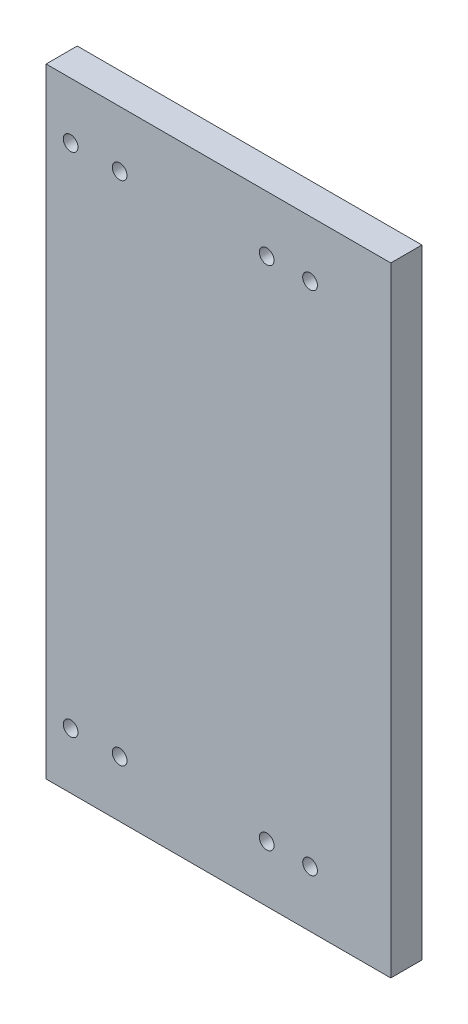
ISO-10303-21;
HEADER;
FILE_DESCRIPTION(('STEP AP214'),'2;1');
FILE_NAME('part.step','',(''),(''),'','','');
FILE_SCHEMA(('AUTOMOTIVE_DESIGN { 1 0 10303 214 1 1 1 1 }'));
ENDSEC;
DATA;
#1=APPLICATION_CONTEXT('core data for automotive mechanical design processes');
#2=APPLICATION_PROTOCOL_DEFINITION('international standard','automotive_design',2000,#1);
#3=PRODUCT_CONTEXT('',#1,'mechanical');
#4=PRODUCT('Part','Part','',(#3));
#5=PRODUCT_RELATED_PRODUCT_CATEGORY('part','',(#4));
#6=PRODUCT_DEFINITION_FORMATION('','',#4);
#7=PRODUCT_DEFINITION_CONTEXT('part definition',#1,'design');
#8=PRODUCT_DEFINITION('design','',#6,#7);
#9=PRODUCT_DEFINITION_SHAPE('','',#8);
#10=(LENGTH_UNIT() NAMED_UNIT(*) SI_UNIT(.MILLI.,.METRE.));
#11=(NAMED_UNIT(*) PLANE_ANGLE_UNIT() SI_UNIT($,.RADIAN.));
#12=(NAMED_UNIT(*) SI_UNIT($,.STERADIAN.) SOLID_ANGLE_UNIT());
#13=UNCERTAINTY_MEASURE_WITH_UNIT(LENGTH_MEASURE(1.E-05),#10,'distance_accuracy_value','');
#14=(GEOMETRIC_REPRESENTATION_CONTEXT(3) GLOBAL_UNCERTAINTY_ASSIGNED_CONTEXT((#13)) GLOBAL_UNIT_ASSIGNED_CONTEXT((#10,
#11,#12)) REPRESENTATION_CONTEXT('',''));
#15=CARTESIAN_POINT('',(0.,0.,0.));
#16=DIRECTION('',(0.,0.,1.));
#17=DIRECTION('',(1.,0.,0.));
#18=AXIS2_PLACEMENT_3D('',#15,#16,#17);
#19=CARTESIAN_POINT('',(0.,0.,6.35));
#20=DIRECTION('',(0.,0.,-1.));
#21=DIRECTION('',(-1.,0.,0.));
#22=AXIS2_PLACEMENT_3D('',#19,#20,#21);
#23=PLANE('',#22);
#24=DIRECTION('',(1.,0.,0.));
#25=VECTOR('',#24,1.);
#26=CARTESIAN_POINT('',(65.1371709194343,27.0166737048767,6.35));
#27=LINE('',#26,#25);
#28=CARTESIAN_POINT('',(-5.17846307717951,27.0166737048767,6.35));
#29=VERTEX_POINT('',#28);
#30=CARTESIAN_POINT('',(65.1371709194343,27.0166737048767,6.35));
#31=VERTEX_POINT('',#30);
#32=EDGE_CURVE('E95',#29,#31,#27,.T.);
#33=ORIENTED_EDGE('',*,*,#32,.T.);
#34=DIRECTION('',(0.,1.,0.));
#35=VECTOR('',#34,1.);
#36=CARTESIAN_POINT('',(65.1371709194343,153.356673704877,6.35));
#37=LINE('',#36,#35);
#38=CARTESIAN_POINT('',(65.1371709194343,153.356673704877,6.35));
#39=VERTEX_POINT('',#38);
#40=EDGE_CURVE('E89',#31,#39,#37,.T.);
#41=ORIENTED_EDGE('',*,*,#40,.T.);
#42=DIRECTION('',(-1.,0.,0.));
#43=VECTOR('',#42,1.);
#44=CARTESIAN_POINT('',(65.1371709194343,153.356673704877,6.35));
#45=LINE('',#44,#43);
#46=CARTESIAN_POINT('',(-5.17846307717951,153.356673704877,6.35));
#47=VERTEX_POINT('',#46);
#48=EDGE_CURVE('E92',#39,#47,#45,.T.);
#49=ORIENTED_EDGE('',*,*,#48,.T.);
#50=DIRECTION('',(0.,-1.,0.));
#51=VECTOR('',#50,1.);
#52=CARTESIAN_POINT('',(-5.17846307717951,153.356673704877,6.35));
#53=LINE('',#52,#51);
#54=EDGE_CURVE('E61',#47,#29,#53,.T.);
#55=ORIENTED_EDGE('',*,*,#54,.T.);
#56=EDGE_LOOP('',(#33,#41,#49,#55));
#57=FACE_BOUND('',#56,.T.);
#58=CARTESIAN_POINT('',(39.8215369228205,38.4866737048767,6.35));
#59=DIRECTION('',(0.,0.,1.));
#60=DIRECTION('',(1.,0.,0.));
#61=AXIS2_PLACEMENT_3D('',#58,#59,#60);
#62=CIRCLE('',#61,1.5);
#63=CARTESIAN_POINT('',(41.3215369228205,38.4866737048767,6.35));
#64=VERTEX_POINT('',#63);
#65=EDGE_CURVE('E117',#64,#64,#62,.T.);
#66=ORIENTED_EDGE('',*,*,#65,.F.);
#67=EDGE_LOOP('',(#66));
#68=FACE_BOUND('',#67,.T.);
#69=CARTESIAN_POINT('',(9.82153692282049,38.4866737048767,6.35));
#70=DIRECTION('',(0.,0.,1.));
#71=DIRECTION('',(1.,0.,0.));
#72=AXIS2_PLACEMENT_3D('',#69,#70,#71);
#73=CIRCLE('',#72,1.5);
#74=CARTESIAN_POINT('',(11.3215369228205,38.4866737048767,6.35));
#75=VERTEX_POINT('',#74);
#76=EDGE_CURVE('E136',#75,#75,#73,.T.);
#77=ORIENTED_EDGE('',*,*,#76,.F.);
#78=EDGE_LOOP('',(#77));
#79=FACE_BOUND('',#78,.T.);
#80=CARTESIAN_POINT('',(-0.178463077179506,38.4866737048767,6.35));
#81=DIRECTION('',(0.,0.,1.));
#82=DIRECTION('',(1.,0.,0.));
#83=AXIS2_PLACEMENT_3D('',#80,#81,#82);
#84=CIRCLE('',#83,1.5);
#85=CARTESIAN_POINT('',(1.3215369228205,38.4866737048767,6.35));
#86=VERTEX_POINT('',#85);
#87=EDGE_CURVE('E144',#86,#86,#84,.T.);
#88=ORIENTED_EDGE('',*,*,#87,.F.);
#89=EDGE_LOOP('',(#88));
#90=FACE_BOUND('',#89,.T.);
#91=CARTESIAN_POINT('',(48.6715369228205,38.4866737048767,6.35));
#92=DIRECTION('',(0.,0.,1.));
#93=DIRECTION('',(1.,0.,0.));
#94=AXIS2_PLACEMENT_3D('',#91,#92,#93);
#95=CIRCLE('',#94,1.5);
#96=CARTESIAN_POINT('',(50.1715369228205,38.4866737048767,6.35));
#97=VERTEX_POINT('',#96);
#98=EDGE_CURVE('E152',#97,#97,#95,.T.);
#99=ORIENTED_EDGE('',*,*,#98,.F.);
#100=EDGE_LOOP('',(#99));
#101=FACE_BOUND('',#100,.T.);
#102=CARTESIAN_POINT('',(48.6715369228205,141.886673704877,6.35));
#103=DIRECTION('',(0.,0.,1.));
#104=DIRECTION('',(-1.,0.,0.));
#105=AXIS2_PLACEMENT_3D('',#102,#103,#104);
#106=CIRCLE('',#105,1.5);
#107=CARTESIAN_POINT('',(47.1715369228205,141.886673704877,6.35));
#108=VERTEX_POINT('',#107);
#109=EDGE_CURVE('E160',#108,#108,#106,.T.);
#110=ORIENTED_EDGE('',*,*,#109,.F.);
#111=EDGE_LOOP('',(#110));
#112=FACE_BOUND('',#111,.T.);
#113=CARTESIAN_POINT('',(-0.178463077179506,141.886673704877,6.35));
#114=DIRECTION('',(0.,0.,1.));
#115=DIRECTION('',(-1.,0.,0.));
#116=AXIS2_PLACEMENT_3D('',#113,#114,#115);
#117=CIRCLE('',#116,1.5);
#118=CARTESIAN_POINT('',(-1.67846307717951,141.886673704877,6.35));
#119=VERTEX_POINT('',#118);
#120=EDGE_CURVE('E168',#119,#119,#117,.T.);
#121=ORIENTED_EDGE('',*,*,#120,.F.);
#122=EDGE_LOOP('',(#121));
#123=FACE_BOUND('',#122,.T.);
#124=CARTESIAN_POINT('',(9.82153692282049,141.886673704877,6.35));
#125=DIRECTION('',(0.,0.,1.));
#126=DIRECTION('',(-1.,0.,0.));
#127=AXIS2_PLACEMENT_3D('',#124,#125,#126);
#128=CIRCLE('',#127,1.5);
#129=CARTESIAN_POINT('',(8.32153692282049,141.886673704877,6.35));
#130=VERTEX_POINT('',#129);
#131=EDGE_CURVE('E176',#130,#130,#128,.T.);
#132=ORIENTED_EDGE('',*,*,#131,.F.);
#133=EDGE_LOOP('',(#132));
#134=FACE_BOUND('',#133,.T.);
#135=CARTESIAN_POINT('',(39.8215369228205,141.886673704877,6.35));
#136=DIRECTION('',(0.,0.,1.));
#137=DIRECTION('',(-1.,0.,0.));
#138=AXIS2_PLACEMENT_3D('',#135,#136,#137);
#139=CIRCLE('',#138,1.5);
#140=CARTESIAN_POINT('',(38.3215369228205,141.886673704877,6.35));
#141=VERTEX_POINT('',#140);
#142=EDGE_CURVE('E184',#141,#141,#139,.T.);
#143=ORIENTED_EDGE('',*,*,#142,.F.);
#144=EDGE_LOOP('',(#143));
#145=FACE_BOUND('',#144,.T.);
#146=ADVANCED_FACE('F43',(#57,#68,#79,#90,#101,#112,#123,#134,#145),#23,.F.);
#147=CARTESIAN_POINT('',(0.,0.,0.));
#148=DIRECTION('',(0.,0.,-1.));
#149=DIRECTION('',(-1.,0.,0.));
#150=AXIS2_PLACEMENT_3D('',#147,#148,#149);
#151=PLANE('',#150);
#152=CARTESIAN_POINT('',(9.82153692282049,141.886673704877,0.));
#153=DIRECTION('',(0.,0.,1.));
#154=DIRECTION('',(-1.,0.,0.));
#155=AXIS2_PLACEMENT_3D('',#152,#153,#154);
#156=CIRCLE('',#155,1.5);
#157=CARTESIAN_POINT('',(8.32153692282049,141.886673704877,0.));
#158=VERTEX_POINT('',#157);
#159=EDGE_CURVE('E180',#158,#158,#156,.T.);
#160=ORIENTED_EDGE('',*,*,#159,.T.);
#161=EDGE_LOOP('',(#160));
#162=FACE_BOUND('',#161,.T.);
#163=CARTESIAN_POINT('',(48.6715369228205,141.886673704877,0.));
#164=DIRECTION('',(0.,0.,1.));
#165=DIRECTION('',(-1.,0.,0.));
#166=AXIS2_PLACEMENT_3D('',#163,#164,#165);
#167=CIRCLE('',#166,1.5);
#168=CARTESIAN_POINT('',(47.1715369228205,141.886673704877,0.));
#169=VERTEX_POINT('',#168);
#170=EDGE_CURVE('E164',#169,#169,#167,.T.);
#171=ORIENTED_EDGE('',*,*,#170,.T.);
#172=EDGE_LOOP('',(#171));
#173=FACE_BOUND('',#172,.T.);
#174=CARTESIAN_POINT('',(-0.178463077179506,38.4866737048767,0.));
#175=DIRECTION('',(0.,0.,1.));
#176=DIRECTION('',(1.,0.,0.));
#177=AXIS2_PLACEMENT_3D('',#174,#175,#176);
#178=CIRCLE('',#177,1.5);
#179=CARTESIAN_POINT('',(1.3215369228205,38.4866737048767,0.));
#180=VERTEX_POINT('',#179);
#181=EDGE_CURVE('E148',#180,#180,#178,.T.);
#182=ORIENTED_EDGE('',*,*,#181,.T.);
#183=EDGE_LOOP('',(#182));
#184=FACE_BOUND('',#183,.T.);
#185=CARTESIAN_POINT('',(39.8215369228205,38.4866737048767,0.));
#186=DIRECTION('',(0.,0.,1.));
#187=DIRECTION('',(1.,0.,0.));
#188=AXIS2_PLACEMENT_3D('',#185,#186,#187);
#189=CIRCLE('',#188,1.5);
#190=CARTESIAN_POINT('',(41.3215369228205,38.4866737048767,0.));
#191=VERTEX_POINT('',#190);
#192=EDGE_CURVE('E132',#191,#191,#189,.T.);
#193=ORIENTED_EDGE('',*,*,#192,.T.);
#194=EDGE_LOOP('',(#193));
#195=FACE_BOUND('',#194,.T.);
#196=DIRECTION('',(1.,0.,0.));
#197=VECTOR('',#196,1.);
#198=CARTESIAN_POINT('',(65.1371709194343,27.0166737048767,0.));
#199=LINE('',#198,#197);
#200=CARTESIAN_POINT('',(-5.17846307717951,27.0166737048767,0.));
#201=VERTEX_POINT('',#200);
#202=CARTESIAN_POINT('',(65.1371709194343,27.0166737048767,0.));
#203=VERTEX_POINT('',#202);
#204=EDGE_CURVE('E113',#201,#203,#199,.T.);
#205=ORIENTED_EDGE('',*,*,#204,.F.);
#206=DIRECTION('',(0.,-1.,0.));
#207=VECTOR('',#206,1.);
#208=CARTESIAN_POINT('',(-5.17846307717951,27.0166737048767,0.));
#209=LINE('',#208,#207);
#210=CARTESIAN_POINT('',(-5.17846307717951,153.356673704877,0.));
#211=VERTEX_POINT('',#210);
#212=EDGE_CURVE('E78',#211,#201,#209,.T.);
#213=ORIENTED_EDGE('',*,*,#212,.F.);
#214=DIRECTION('',(-1.,0.,0.));
#215=VECTOR('',#214,1.);
#216=CARTESIAN_POINT('',(65.1371709194343,153.356673704877,0.));
#217=LINE('',#216,#215);
#218=CARTESIAN_POINT('',(65.1371709194343,153.356673704877,0.));
#219=VERTEX_POINT('',#218);
#220=EDGE_CURVE('E120',#219,#211,#217,.T.);
#221=ORIENTED_EDGE('',*,*,#220,.F.);
#222=DIRECTION('',(0.,1.,0.));
#223=VECTOR('',#222,1.);
#224=CARTESIAN_POINT('',(65.1371709194343,153.356673704877,0.));
#225=LINE('',#224,#223);
#226=EDGE_CURVE('E101',#203,#219,#225,.T.);
#227=ORIENTED_EDGE('',*,*,#226,.F.);
#228=EDGE_LOOP('',(#205,#213,#221,#227));
#229=FACE_BOUND('',#228,.T.);
#230=CARTESIAN_POINT('',(9.82153692282049,38.4866737048767,0.));
#231=DIRECTION('',(0.,0.,1.));
#232=DIRECTION('',(1.,0.,0.));
#233=AXIS2_PLACEMENT_3D('',#230,#231,#232);
#234=CIRCLE('',#233,1.5);
#235=CARTESIAN_POINT('',(11.3215369228205,38.4866737048767,0.));
#236=VERTEX_POINT('',#235);
#237=EDGE_CURVE('E140',#236,#236,#234,.T.);
#238=ORIENTED_EDGE('',*,*,#237,.T.);
#239=EDGE_LOOP('',(#238));
#240=FACE_BOUND('',#239,.T.);
#241=CARTESIAN_POINT('',(48.6715369228205,38.4866737048767,0.));
#242=DIRECTION('',(0.,0.,1.));
#243=DIRECTION('',(1.,0.,0.));
#244=AXIS2_PLACEMENT_3D('',#241,#242,#243);
#245=CIRCLE('',#244,1.5);
#246=CARTESIAN_POINT('',(50.1715369228205,38.4866737048767,0.));
#247=VERTEX_POINT('',#246);
#248=EDGE_CURVE('E156',#247,#247,#245,.T.);
#249=ORIENTED_EDGE('',*,*,#248,.T.);
#250=EDGE_LOOP('',(#249));
#251=FACE_BOUND('',#250,.T.);
#252=CARTESIAN_POINT('',(-0.178463077179506,141.886673704877,0.));
#253=DIRECTION('',(0.,0.,1.));
#254=DIRECTION('',(-1.,0.,0.));
#255=AXIS2_PLACEMENT_3D('',#252,#253,#254);
#256=CIRCLE('',#255,1.5);
#257=CARTESIAN_POINT('',(-1.67846307717951,141.886673704877,0.));
#258=VERTEX_POINT('',#257);
#259=EDGE_CURVE('E172',#258,#258,#256,.T.);
#260=ORIENTED_EDGE('',*,*,#259,.T.);
#261=EDGE_LOOP('',(#260));
#262=FACE_BOUND('',#261,.T.);
#263=CARTESIAN_POINT('',(39.8215369228205,141.886673704877,0.));
#264=DIRECTION('',(0.,0.,1.));
#265=DIRECTION('',(-1.,0.,0.));
#266=AXIS2_PLACEMENT_3D('',#263,#264,#265);
#267=CIRCLE('',#266,1.5);
#268=CARTESIAN_POINT('',(38.3215369228205,141.886673704877,0.));
#269=VERTEX_POINT('',#268);
#270=EDGE_CURVE('E188',#269,#269,#267,.T.);
#271=ORIENTED_EDGE('',*,*,#270,.T.);
#272=EDGE_LOOP('',(#271));
#273=FACE_BOUND('',#272,.T.);
#274=ADVANCED_FACE('F200',(#162,#173,#184,#195,#229,#240,#251,#262,#273),#151,.T.);
#275=CARTESIAN_POINT('',(65.1371709194343,27.0166737048767,6.35));
#276=DIRECTION('',(0.,1.,0.));
#277=DIRECTION('',(-1.,0.,0.));
#278=AXIS2_PLACEMENT_3D('',#275,#276,#277);
#279=PLANE('',#278);
#280=ORIENTED_EDGE('',*,*,#204,.T.);
#281=DIRECTION('',(0.,0.,-1.));
#282=VECTOR('',#281,1.);
#283=CARTESIAN_POINT('',(65.1371709194343,27.0166737048767,6.35));
#284=LINE('',#283,#282);
#285=EDGE_CURVE('E11',#31,#203,#284,.T.);
#286=ORIENTED_EDGE('',*,*,#285,.F.);
#287=ORIENTED_EDGE('',*,*,#32,.F.);
#288=DIRECTION('',(0.,0.,-1.));
#289=VECTOR('',#288,1.);
#290=CARTESIAN_POINT('',(-5.17846307717951,27.0166737048767,6.35));
#291=LINE('',#290,#289);
#292=EDGE_CURVE('E109',#29,#201,#291,.T.);
#293=ORIENTED_EDGE('',*,*,#292,.T.);
#294=EDGE_LOOP('',(#280,#286,#287,#293));
#295=FACE_BOUND('',#294,.T.);
#296=ADVANCED_FACE('F45',(#295),#279,.F.);
#297=CARTESIAN_POINT('',(65.1371709194343,153.356673704877,6.35));
#298=DIRECTION('',(-1.,0.,0.));
#299=DIRECTION('',(0.,0.,1.));
#300=AXIS2_PLACEMENT_3D('',#297,#298,#299);
#301=PLANE('',#300);
#302=ORIENTED_EDGE('',*,*,#226,.T.);
#303=DIRECTION('',(0.,0.,-1.));
#304=VECTOR('',#303,1.);
#305=CARTESIAN_POINT('',(65.1371709194343,153.356673704877,6.35));
#306=LINE('',#305,#304);
#307=EDGE_CURVE('E53',#39,#219,#306,.T.);
#308=ORIENTED_EDGE('',*,*,#307,.F.);
#309=ORIENTED_EDGE('',*,*,#40,.F.);
#310=ORIENTED_EDGE('',*,*,#285,.T.);
#311=EDGE_LOOP('',(#302,#308,#309,#310));
#312=FACE_BOUND('',#311,.T.);
#313=ADVANCED_FACE('F100',(#312),#301,.F.);
#314=CARTESIAN_POINT('',(65.1371709194343,153.356673704877,6.35));
#315=DIRECTION('',(0.,-1.,0.));
#316=DIRECTION('',(0.,0.,-1.));
#317=AXIS2_PLACEMENT_3D('',#314,#315,#316);
#318=PLANE('',#317);
#319=ORIENTED_EDGE('',*,*,#220,.T.);
#320=DIRECTION('',(0.,0.,-1.));
#321=VECTOR('',#320,1.);
#322=CARTESIAN_POINT('',(-5.17846307717951,153.356673704877,6.35));
#323=LINE('',#322,#321);
#324=EDGE_CURVE('E104',#47,#211,#323,.T.);
#325=ORIENTED_EDGE('',*,*,#324,.F.);
#326=ORIENTED_EDGE('',*,*,#48,.F.);
#327=ORIENTED_EDGE('',*,*,#307,.T.);
#328=EDGE_LOOP('',(#319,#325,#326,#327));
#329=FACE_BOUND('',#328,.T.);
#330=ADVANCED_FACE('F105',(#329),#318,.F.);
#331=CARTESIAN_POINT('',(-5.17846307717951,27.0166737048767,6.35));
#332=DIRECTION('',(1.,0.,0.));
#333=DIRECTION('',(0.,0.,-1.));
#334=AXIS2_PLACEMENT_3D('',#331,#332,#333);
#335=PLANE('',#334);
#336=ORIENTED_EDGE('',*,*,#212,.T.);
#337=ORIENTED_EDGE('',*,*,#292,.F.);
#338=ORIENTED_EDGE('',*,*,#54,.F.);
#339=ORIENTED_EDGE('',*,*,#324,.T.);
#340=EDGE_LOOP('',(#336,#337,#338,#339));
#341=FACE_BOUND('',#340,.T.);
#342=ADVANCED_FACE('F128',(#341),#335,.F.);
#343=CARTESIAN_POINT('',(39.8215369228205,38.4866737048767,6.35));
#344=DIRECTION('',(0.,0.,-1.));
#345=DIRECTION('',(-1.,0.,0.));
#346=AXIS2_PLACEMENT_3D('',#343,#344,#345);
#347=CYLINDRICAL_SURFACE('',#346,1.5);
#348=ORIENTED_EDGE('',*,*,#65,.T.);
#349=EDGE_LOOP('',(#348));
#350=FACE_BOUND('',#349,.T.);
#351=ORIENTED_EDGE('',*,*,#192,.F.);
#352=EDGE_LOOP('',(#351));
#353=FACE_BOUND('',#352,.T.);
#354=ADVANCED_FACE('F208',(#350,#353),#347,.F.);
#355=CARTESIAN_POINT('',(9.82153692282049,38.4866737048767,6.35));
#356=DIRECTION('',(0.,0.,-1.));
#357=DIRECTION('',(-1.,0.,0.));
#358=AXIS2_PLACEMENT_3D('',#355,#356,#357);
#359=CYLINDRICAL_SURFACE('',#358,1.5);
#360=ORIENTED_EDGE('',*,*,#76,.T.);
#361=EDGE_LOOP('',(#360));
#362=FACE_BOUND('',#361,.T.);
#363=ORIENTED_EDGE('',*,*,#237,.F.);
#364=EDGE_LOOP('',(#363));
#365=FACE_BOUND('',#364,.T.);
#366=ADVANCED_FACE('F262',(#362,#365),#359,.F.);
#367=CARTESIAN_POINT('',(-0.178463077179506,38.4866737048767,6.35));
#368=DIRECTION('',(0.,0.,-1.));
#369=DIRECTION('',(-1.,0.,0.));
#370=AXIS2_PLACEMENT_3D('',#367,#368,#369);
#371=CYLINDRICAL_SURFACE('',#370,1.5);
#372=ORIENTED_EDGE('',*,*,#87,.T.);
#373=EDGE_LOOP('',(#372));
#374=FACE_BOUND('',#373,.T.);
#375=ORIENTED_EDGE('',*,*,#181,.F.);
#376=EDGE_LOOP('',(#375));
#377=FACE_BOUND('',#376,.T.);
#378=ADVANCED_FACE('F272',(#374,#377),#371,.F.);
#379=CARTESIAN_POINT('',(48.6715369228205,38.4866737048767,6.35));
#380=DIRECTION('',(0.,0.,-1.));
#381=DIRECTION('',(-1.,0.,0.));
#382=AXIS2_PLACEMENT_3D('',#379,#380,#381);
#383=CYLINDRICAL_SURFACE('',#382,1.5);
#384=ORIENTED_EDGE('',*,*,#98,.T.);
#385=EDGE_LOOP('',(#384));
#386=FACE_BOUND('',#385,.T.);
#387=ORIENTED_EDGE('',*,*,#248,.F.);
#388=EDGE_LOOP('',(#387));
#389=FACE_BOUND('',#388,.T.);
#390=ADVANCED_FACE('F281',(#386,#389),#383,.F.);
#391=CARTESIAN_POINT('',(48.6715369228205,141.886673704877,6.35));
#392=DIRECTION('',(0.,0.,-1.));
#393=DIRECTION('',(-1.,0.,0.));
#394=AXIS2_PLACEMENT_3D('',#391,#392,#393);
#395=CYLINDRICAL_SURFACE('',#394,1.5);
#396=ORIENTED_EDGE('',*,*,#109,.T.);
#397=EDGE_LOOP('',(#396));
#398=FACE_BOUND('',#397,.T.);
#399=ORIENTED_EDGE('',*,*,#170,.F.);
#400=EDGE_LOOP('',(#399));
#401=FACE_BOUND('',#400,.T.);
#402=ADVANCED_FACE('F291',(#398,#401),#395,.F.);
#403=CARTESIAN_POINT('',(-0.178463077179506,141.886673704877,6.35));
#404=DIRECTION('',(0.,0.,-1.));
#405=DIRECTION('',(-1.,0.,0.));
#406=AXIS2_PLACEMENT_3D('',#403,#404,#405);
#407=CYLINDRICAL_SURFACE('',#406,1.5);
#408=ORIENTED_EDGE('',*,*,#120,.T.);
#409=EDGE_LOOP('',(#408));
#410=FACE_BOUND('',#409,.T.);
#411=ORIENTED_EDGE('',*,*,#259,.F.);
#412=EDGE_LOOP('',(#411));
#413=FACE_BOUND('',#412,.T.);
#414=ADVANCED_FACE('F301',(#410,#413),#407,.F.);
#415=CARTESIAN_POINT('',(9.82153692282049,141.886673704877,6.35));
#416=DIRECTION('',(0.,0.,-1.));
#417=DIRECTION('',(-1.,0.,0.));
#418=AXIS2_PLACEMENT_3D('',#415,#416,#417);
#419=CYLINDRICAL_SURFACE('',#418,1.5);
#420=ORIENTED_EDGE('',*,*,#131,.T.);
#421=EDGE_LOOP('',(#420));
#422=FACE_BOUND('',#421,.T.);
#423=ORIENTED_EDGE('',*,*,#159,.F.);
#424=EDGE_LOOP('',(#423));
#425=FACE_BOUND('',#424,.T.);
#426=ADVANCED_FACE('F311',(#422,#425),#419,.F.);
#427=CARTESIAN_POINT('',(39.8215369228205,141.886673704877,6.35));
#428=DIRECTION('',(0.,0.,-1.));
#429=DIRECTION('',(-1.,0.,0.));
#430=AXIS2_PLACEMENT_3D('',#427,#428,#429);
#431=CYLINDRICAL_SURFACE('',#430,1.5);
#432=ORIENTED_EDGE('',*,*,#142,.T.);
#433=EDGE_LOOP('',(#432));
#434=FACE_BOUND('',#433,.T.);
#435=ORIENTED_EDGE('',*,*,#270,.F.);
#436=EDGE_LOOP('',(#435));
#437=FACE_BOUND('',#436,.T.);
#438=ADVANCED_FACE('F196',(#434,#437),#431,.F.);
#439=CLOSED_SHELL('',(#146,#274,#296,#313,#330,#342,#354,#366,#378,#390,#402,#414,#426,#438));
#440=MANIFOLD_SOLID_BREP('B2',#439);
#441=ADVANCED_BREP_SHAPE_REPRESENTATION('',(#18,#440),#14);
#442=SHAPE_DEFINITION_REPRESENTATION(#9,#441);
ENDSEC;
END-ISO-10303-21;
